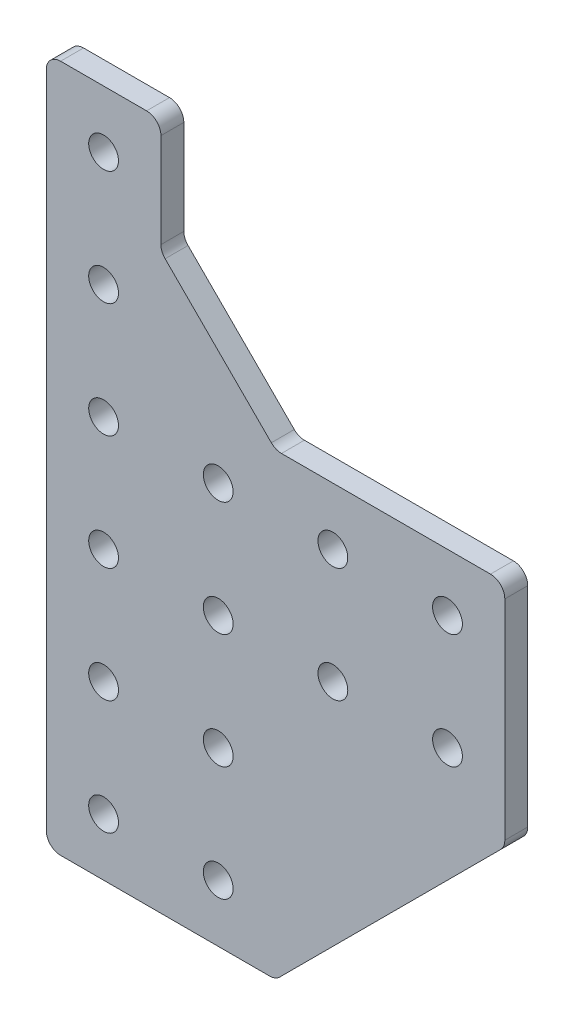
ISO-10303-21;
HEADER;
FILE_DESCRIPTION(('STEP AP214'),'2;1');
FILE_NAME('part.step','',(''),(''),'','','');
FILE_SCHEMA(('AUTOMOTIVE_DESIGN { 1 0 10303 214 1 1 1 1 }'));
ENDSEC;
DATA;
#1=APPLICATION_CONTEXT('core data for automotive mechanical design processes');
#2=APPLICATION_PROTOCOL_DEFINITION('international standard','automotive_design',2000,#1);
#3=PRODUCT_CONTEXT('',#1,'mechanical');
#4=PRODUCT('Part','Part','',(#3));
#5=PRODUCT_RELATED_PRODUCT_CATEGORY('part','',(#4));
#6=PRODUCT_DEFINITION_FORMATION('','',#4);
#7=PRODUCT_DEFINITION_CONTEXT('part definition',#1,'design');
#8=PRODUCT_DEFINITION('design','',#6,#7);
#9=PRODUCT_DEFINITION_SHAPE('','',#8);
#10=(LENGTH_UNIT() NAMED_UNIT(*) SI_UNIT(.MILLI.,.METRE.));
#11=(NAMED_UNIT(*) PLANE_ANGLE_UNIT() SI_UNIT($,.RADIAN.));
#12=(NAMED_UNIT(*) SI_UNIT($,.STERADIAN.) SOLID_ANGLE_UNIT());
#13=UNCERTAINTY_MEASURE_WITH_UNIT(LENGTH_MEASURE(1.E-05),#10,'distance_accuracy_value','');
#14=(GEOMETRIC_REPRESENTATION_CONTEXT(3) GLOBAL_UNCERTAINTY_ASSIGNED_CONTEXT((#13)) GLOBAL_UNIT_ASSIGNED_CONTEXT((#10,
#11,#12)) REPRESENTATION_CONTEXT('',''));
#15=CARTESIAN_POINT('',(0.,0.,0.));
#16=DIRECTION('',(0.,0.,1.));
#17=DIRECTION('',(1.,0.,0.));
#18=AXIS2_PLACEMENT_3D('',#15,#16,#17);
#19=CARTESIAN_POINT('',(2.5,37.5,4.));
#20=DIRECTION('',(0.,0.,-1.));
#21=DIRECTION('',(-1.,0.,0.));
#22=AXIS2_PLACEMENT_3D('',#19,#20,#21);
#23=PLANE('',#22);
#24=DIRECTION('',(0.,-1.,0.));
#25=VECTOR('',#24,1.);
#26=CARTESIAN_POINT('',(0.,0.,4.));
#27=LINE('',#26,#25);
#28=CARTESIAN_POINT('',(0.,37.5,4.));
#29=VERTEX_POINT('',#28);
#30=CARTESIAN_POINT('',(0.,-77.5,4.));
#31=VERTEX_POINT('',#30);
#32=EDGE_CURVE('E119',#29,#31,#27,.T.);
#33=ORIENTED_EDGE('',*,*,#32,.T.);
#34=CARTESIAN_POINT('',(2.5,-77.5,4.));
#35=DIRECTION('',(0.,0.,1.));
#36=DIRECTION('',(1.,0.,0.));
#37=AXIS2_PLACEMENT_3D('',#34,#35,#36);
#38=CIRCLE('',#37,2.5);
#39=CARTESIAN_POINT('',(2.50000000000002,-80.,4.));
#40=VERTEX_POINT('',#39);
#41=EDGE_CURVE('E300',#31,#40,#38,.T.);
#42=ORIENTED_EDGE('',*,*,#41,.T.);
#43=DIRECTION('',(1.,0.,0.));
#44=VECTOR('',#43,1.);
#45=CARTESIAN_POINT('',(2.50000000000002,-80.,4.));
#46=LINE('',#45,#44);
#47=CARTESIAN_POINT('',(38.9644660940673,-80.,4.));
#48=VERTEX_POINT('',#47);
#49=EDGE_CURVE('E251',#40,#48,#46,.T.);
#50=ORIENTED_EDGE('',*,*,#49,.T.);
#51=CARTESIAN_POINT('',(38.9644660940673,-77.5,4.));
#52=DIRECTION('',(0.,0.,1.));
#53=DIRECTION('',(-1.,0.,0.));
#54=AXIS2_PLACEMENT_3D('',#51,#52,#53);
#55=CIRCLE('',#54,2.50000000000001);
#56=CARTESIAN_POINT('',(40.7322330470336,-79.2677669529664,4.));
#57=VERTEX_POINT('',#56);
#58=EDGE_CURVE('E270',#48,#57,#55,.T.);
#59=ORIENTED_EDGE('',*,*,#58,.T.);
#60=DIRECTION('',(0.707106781186547,0.707106781186548,0.));
#61=VECTOR('',#60,1.);
#62=CARTESIAN_POINT('',(40.7322330470336,-79.2677669529664,4.));
#63=LINE('',#62,#61);
#64=CARTESIAN_POINT('',(79.2677669529664,-40.7322330470336,4.));
#65=VERTEX_POINT('',#64);
#66=EDGE_CURVE('E267',#57,#65,#63,.T.);
#67=ORIENTED_EDGE('',*,*,#66,.T.);
#68=CARTESIAN_POINT('',(77.5,-38.9644660940673,4.));
#69=DIRECTION('',(0.,0.,1.));
#70=DIRECTION('',(-1.,0.,0.));
#71=AXIS2_PLACEMENT_3D('',#68,#69,#70);
#72=CIRCLE('',#71,2.5);
#73=CARTESIAN_POINT('',(80.,-38.9644660940673,4.));
#74=VERTEX_POINT('',#73);
#75=EDGE_CURVE('E269',#65,#74,#72,.T.);
#76=ORIENTED_EDGE('',*,*,#75,.T.);
#77=DIRECTION('',(0.,1.,0.));
#78=VECTOR('',#77,1.);
#79=CARTESIAN_POINT('',(80.,-2.5,4.));
#80=LINE('',#79,#78);
#81=CARTESIAN_POINT('',(80.,-2.5,4.));
#82=VERTEX_POINT('',#81);
#83=EDGE_CURVE('E272',#74,#82,#80,.T.);
#84=ORIENTED_EDGE('',*,*,#83,.T.);
#85=CARTESIAN_POINT('',(77.5,-2.5,4.));
#86=DIRECTION('',(0.,0.,1.));
#87=DIRECTION('',(-1.,0.,0.));
#88=AXIS2_PLACEMENT_3D('',#85,#86,#87);
#89=CIRCLE('',#88,2.5);
#90=CARTESIAN_POINT('',(77.5,0.,4.));
#91=VERTEX_POINT('',#90);
#92=EDGE_CURVE('E278',#82,#91,#89,.T.);
#93=ORIENTED_EDGE('',*,*,#92,.T.);
#94=DIRECTION('',(-1.,0.,0.));
#95=VECTOR('',#94,1.);
#96=CARTESIAN_POINT('',(41.0355339059327,0.,4.));
#97=LINE('',#96,#95);
#98=CARTESIAN_POINT('',(41.0355339059327,0.,4.));
#99=VERTEX_POINT('',#98);
#100=EDGE_CURVE('E280',#91,#99,#97,.T.);
#101=ORIENTED_EDGE('',*,*,#100,.T.);
#102=CARTESIAN_POINT('',(41.0355339059327,2.5,4.));
#103=DIRECTION('',(0.,0.,-1.));
#104=DIRECTION('',(1.,0.,0.));
#105=AXIS2_PLACEMENT_3D('',#102,#103,#104);
#106=CIRCLE('',#105,2.5);
#107=CARTESIAN_POINT('',(39.2677669529663,0.732233047033641,4.));
#108=VERTEX_POINT('',#107);
#109=EDGE_CURVE('E282',#99,#108,#106,.T.);
#110=ORIENTED_EDGE('',*,*,#109,.T.);
#111=DIRECTION('',(-0.707106781186546,0.707106781186549,0.));
#112=VECTOR('',#111,1.);
#113=CARTESIAN_POINT('',(20.7322330470336,19.2677669529664,4.));
#114=LINE('',#113,#112);
#115=CARTESIAN_POINT('',(20.7322330470336,19.2677669529664,4.));
#116=VERTEX_POINT('',#115);
#117=EDGE_CURVE('E284',#108,#116,#114,.T.);
#118=ORIENTED_EDGE('',*,*,#117,.T.);
#119=CARTESIAN_POINT('',(22.5,21.0355339059327,4.));
#120=DIRECTION('',(0.,0.,-1.));
#121=DIRECTION('',(1.,0.,0.));
#122=AXIS2_PLACEMENT_3D('',#119,#120,#121);
#123=CIRCLE('',#122,2.5);
#124=CARTESIAN_POINT('',(20.,21.0355339059327,4.));
#125=VERTEX_POINT('',#124);
#126=EDGE_CURVE('E286',#116,#125,#123,.T.);
#127=ORIENTED_EDGE('',*,*,#126,.T.);
#128=DIRECTION('',(0.,1.,0.));
#129=VECTOR('',#128,1.);
#130=CARTESIAN_POINT('',(20.,37.5,4.));
#131=LINE('',#130,#129);
#132=CARTESIAN_POINT('',(20.,37.5,4.));
#133=VERTEX_POINT('',#132);
#134=EDGE_CURVE('E163',#125,#133,#131,.T.);
#135=ORIENTED_EDGE('',*,*,#134,.T.);
#136=CARTESIAN_POINT('',(17.5,37.5,4.));
#137=DIRECTION('',(0.,0.,1.));
#138=DIRECTION('',(-1.,0.,0.));
#139=AXIS2_PLACEMENT_3D('',#136,#137,#138);
#140=CIRCLE('',#139,2.5);
#141=CARTESIAN_POINT('',(17.5,40.,4.));
#142=VERTEX_POINT('',#141);
#143=EDGE_CURVE('E157',#133,#142,#140,.T.);
#144=ORIENTED_EDGE('',*,*,#143,.T.);
#145=DIRECTION('',(-1.,0.,0.));
#146=VECTOR('',#145,1.);
#147=CARTESIAN_POINT('',(2.50000000000002,40.,4.));
#148=LINE('',#147,#146);
#149=CARTESIAN_POINT('',(2.50000000000002,40.,4.));
#150=VERTEX_POINT('',#149);
#151=EDGE_CURVE('E161',#142,#150,#148,.T.);
#152=ORIENTED_EDGE('',*,*,#151,.T.);
#153=CARTESIAN_POINT('',(2.5,37.5,4.));
#154=DIRECTION('',(0.,0.,1.));
#155=DIRECTION('',(-1.,0.,0.));
#156=AXIS2_PLACEMENT_3D('',#153,#154,#155);
#157=CIRCLE('',#156,2.5);
#158=EDGE_CURVE('E53',#150,#29,#157,.T.);
#159=ORIENTED_EDGE('',*,*,#158,.T.);
#160=EDGE_LOOP('',(#33,#42,#50,#59,#67,#76,#84,#93,#101,#110,#118,#127,#135,#144,#152,#159));
#161=FACE_BOUND('',#160,.T.);
#162=CARTESIAN_POINT('',(10.,-10.,4.));
#163=DIRECTION('',(0.,0.,1.));
#164=DIRECTION('',(1.,0.,0.));
#165=AXIS2_PLACEMENT_3D('',#162,#163,#164);
#166=CIRCLE('',#165,2.6);
#167=CARTESIAN_POINT('',(12.6,-10.,4.));
#168=VERTEX_POINT('',#167);
#169=EDGE_CURVE('E183',#168,#168,#166,.T.);
#170=ORIENTED_EDGE('',*,*,#169,.F.);
#171=EDGE_LOOP('',(#170));
#172=FACE_BOUND('',#171,.T.);
#173=CARTESIAN_POINT('',(30.,-10.,4.));
#174=DIRECTION('',(0.,0.,1.));
#175=DIRECTION('',(1.,0.,0.));
#176=AXIS2_PLACEMENT_3D('',#173,#174,#175);
#177=CIRCLE('',#176,2.6);
#178=CARTESIAN_POINT('',(32.6,-10.,4.));
#179=VERTEX_POINT('',#178);
#180=EDGE_CURVE('E683',#179,#179,#177,.T.);
#181=ORIENTED_EDGE('',*,*,#180,.F.);
#182=EDGE_LOOP('',(#181));
#183=FACE_BOUND('',#182,.T.);
#184=CARTESIAN_POINT('',(30.0000000000002,-30.,4.));
#185=DIRECTION('',(0.,0.,1.));
#186=DIRECTION('',(1.,0.,0.));
#187=AXIS2_PLACEMENT_3D('',#184,#185,#186);
#188=CIRCLE('',#187,2.6);
#189=CARTESIAN_POINT('',(32.6000000000002,-30.,4.));
#190=VERTEX_POINT('',#189);
#191=EDGE_CURVE('E677',#190,#190,#188,.T.);
#192=ORIENTED_EDGE('',*,*,#191,.F.);
#193=EDGE_LOOP('',(#192));
#194=FACE_BOUND('',#193,.T.);
#195=CARTESIAN_POINT('',(30.0000000000004,-50.,4.));
#196=DIRECTION('',(0.,0.,1.));
#197=DIRECTION('',(1.,0.,0.));
#198=AXIS2_PLACEMENT_3D('',#195,#196,#197);
#199=CIRCLE('',#198,2.6);
#200=CARTESIAN_POINT('',(32.6000000000004,-50.,4.));
#201=VERTEX_POINT('',#200);
#202=EDGE_CURVE('E671',#201,#201,#199,.T.);
#203=ORIENTED_EDGE('',*,*,#202,.F.);
#204=EDGE_LOOP('',(#203));
#205=FACE_BOUND('',#204,.T.);
#206=CARTESIAN_POINT('',(30.0000000000006,-70.,4.));
#207=DIRECTION('',(0.,0.,1.));
#208=DIRECTION('',(1.,0.,0.));
#209=AXIS2_PLACEMENT_3D('',#206,#207,#208);
#210=CIRCLE('',#209,2.59999999999999);
#211=CARTESIAN_POINT('',(32.6000000000006,-70.,4.));
#212=VERTEX_POINT('',#211);
#213=EDGE_CURVE('E665',#212,#212,#210,.T.);
#214=ORIENTED_EDGE('',*,*,#213,.F.);
#215=EDGE_LOOP('',(#214));
#216=FACE_BOUND('',#215,.T.);
#217=CARTESIAN_POINT('',(10.0000000000002,-30.,4.));
#218=DIRECTION('',(0.,0.,1.));
#219=DIRECTION('',(1.,0.,0.));
#220=AXIS2_PLACEMENT_3D('',#217,#218,#219);
#221=CIRCLE('',#220,2.6);
#222=CARTESIAN_POINT('',(12.6000000000002,-30.,4.));
#223=VERTEX_POINT('',#222);
#224=EDGE_CURVE('E659',#223,#223,#221,.T.);
#225=ORIENTED_EDGE('',*,*,#224,.F.);
#226=EDGE_LOOP('',(#225));
#227=FACE_BOUND('',#226,.T.);
#228=CARTESIAN_POINT('',(10.0000000000004,-50.,4.));
#229=DIRECTION('',(0.,0.,1.));
#230=DIRECTION('',(1.,0.,0.));
#231=AXIS2_PLACEMENT_3D('',#228,#229,#230);
#232=CIRCLE('',#231,2.6);
#233=CARTESIAN_POINT('',(12.6000000000004,-50.,4.));
#234=VERTEX_POINT('',#233);
#235=EDGE_CURVE('E653',#234,#234,#232,.T.);
#236=ORIENTED_EDGE('',*,*,#235,.F.);
#237=EDGE_LOOP('',(#236));
#238=FACE_BOUND('',#237,.T.);
#239=CARTESIAN_POINT('',(10.0000000000006,-70.,4.));
#240=DIRECTION('',(0.,0.,1.));
#241=DIRECTION('',(1.,0.,0.));
#242=AXIS2_PLACEMENT_3D('',#239,#240,#241);
#243=CIRCLE('',#242,2.6);
#244=CARTESIAN_POINT('',(12.6000000000006,-70.,4.));
#245=VERTEX_POINT('',#244);
#246=EDGE_CURVE('E647',#245,#245,#243,.T.);
#247=ORIENTED_EDGE('',*,*,#246,.F.);
#248=EDGE_LOOP('',(#247));
#249=FACE_BOUND('',#248,.T.);
#250=CARTESIAN_POINT('',(50.,-10.,4.));
#251=DIRECTION('',(0.,0.,1.));
#252=DIRECTION('',(1.,0.,0.));
#253=AXIS2_PLACEMENT_3D('',#250,#251,#252);
#254=CIRCLE('',#253,2.6);
#255=CARTESIAN_POINT('',(52.6,-10.,4.));
#256=VERTEX_POINT('',#255);
#257=EDGE_CURVE('E641',#256,#256,#254,.T.);
#258=ORIENTED_EDGE('',*,*,#257,.F.);
#259=EDGE_LOOP('',(#258));
#260=FACE_BOUND('',#259,.T.);
#261=CARTESIAN_POINT('',(50.0000000000002,-30.,4.));
#262=DIRECTION('',(0.,0.,1.));
#263=DIRECTION('',(1.,0.,0.));
#264=AXIS2_PLACEMENT_3D('',#261,#262,#263);
#265=CIRCLE('',#264,2.6);
#266=CARTESIAN_POINT('',(52.6000000000002,-30.,4.));
#267=VERTEX_POINT('',#266);
#268=EDGE_CURVE('E635',#267,#267,#265,.T.);
#269=ORIENTED_EDGE('',*,*,#268,.F.);
#270=EDGE_LOOP('',(#269));
#271=FACE_BOUND('',#270,.T.);
#272=CARTESIAN_POINT('',(70.,-10.,4.));
#273=DIRECTION('',(0.,0.,1.));
#274=DIRECTION('',(1.,0.,0.));
#275=AXIS2_PLACEMENT_3D('',#272,#273,#274);
#276=CIRCLE('',#275,2.59999999999999);
#277=CARTESIAN_POINT('',(72.6,-10.,4.));
#278=VERTEX_POINT('',#277);
#279=EDGE_CURVE('E629',#278,#278,#276,.T.);
#280=ORIENTED_EDGE('',*,*,#279,.F.);
#281=EDGE_LOOP('',(#280));
#282=FACE_BOUND('',#281,.T.);
#283=CARTESIAN_POINT('',(70.0000000000002,-30.,4.));
#284=DIRECTION('',(0.,0.,1.));
#285=DIRECTION('',(1.,0.,0.));
#286=AXIS2_PLACEMENT_3D('',#283,#284,#285);
#287=CIRCLE('',#286,2.60000000000002);
#288=CARTESIAN_POINT('',(72.6000000000002,-30.,4.));
#289=VERTEX_POINT('',#288);
#290=EDGE_CURVE('E623',#289,#289,#287,.T.);
#291=ORIENTED_EDGE('',*,*,#290,.F.);
#292=EDGE_LOOP('',(#291));
#293=FACE_BOUND('',#292,.T.);
#294=CARTESIAN_POINT('',(9.99999999999993,10.,4.));
#295=DIRECTION('',(0.,0.,1.));
#296=DIRECTION('',(1.,0.,0.));
#297=AXIS2_PLACEMENT_3D('',#294,#295,#296);
#298=CIRCLE('',#297,2.6);
#299=CARTESIAN_POINT('',(12.5999999999999,10.,4.));
#300=VERTEX_POINT('',#299);
#301=EDGE_CURVE('E617',#300,#300,#298,.T.);
#302=ORIENTED_EDGE('',*,*,#301,.F.);
#303=EDGE_LOOP('',(#302));
#304=FACE_BOUND('',#303,.T.);
#305=CARTESIAN_POINT('',(9.99999999999986,30.,4.));
#306=DIRECTION('',(0.,0.,1.));
#307=DIRECTION('',(1.,0.,0.));
#308=AXIS2_PLACEMENT_3D('',#305,#306,#307);
#309=CIRCLE('',#308,2.6);
#310=CARTESIAN_POINT('',(12.5999999999999,30.,4.));
#311=VERTEX_POINT('',#310);
#312=EDGE_CURVE('E608',#311,#311,#309,.T.);
#313=ORIENTED_EDGE('',*,*,#312,.F.);
#314=EDGE_LOOP('',(#313));
#315=FACE_BOUND('',#314,.T.);
#316=ADVANCED_FACE('F36',(#161,#172,#183,#194,#205,#216,#227,#238,#249,#260,#271,#282,#293,#304,
#315),#23,.F.);
#317=CARTESIAN_POINT('',(2.5,37.5,0.));
#318=DIRECTION('',(0.,0.,-1.));
#319=DIRECTION('',(-1.,0.,0.));
#320=AXIS2_PLACEMENT_3D('',#317,#318,#319);
#321=PLANE('',#320);
#322=CARTESIAN_POINT('',(9.99999999999993,10.,0.));
#323=DIRECTION('',(0.,0.,1.));
#324=DIRECTION('',(1.,0.,0.));
#325=AXIS2_PLACEMENT_3D('',#322,#323,#324);
#326=CIRCLE('',#325,2.6);
#327=CARTESIAN_POINT('',(12.5999999999999,10.,0.));
#328=VERTEX_POINT('',#327);
#329=EDGE_CURVE('E614',#328,#328,#326,.T.);
#330=ORIENTED_EDGE('',*,*,#329,.T.);
#331=EDGE_LOOP('',(#330));
#332=FACE_BOUND('',#331,.T.);
#333=CARTESIAN_POINT('',(70.,-10.,0.));
#334=DIRECTION('',(0.,0.,1.));
#335=DIRECTION('',(1.,0.,0.));
#336=AXIS2_PLACEMENT_3D('',#333,#334,#335);
#337=CIRCLE('',#336,2.59999999999999);
#338=CARTESIAN_POINT('',(72.6,-10.,0.));
#339=VERTEX_POINT('',#338);
#340=EDGE_CURVE('E626',#339,#339,#337,.T.);
#341=ORIENTED_EDGE('',*,*,#340,.T.);
#342=EDGE_LOOP('',(#341));
#343=FACE_BOUND('',#342,.T.);
#344=CARTESIAN_POINT('',(50.,-10.,0.));
#345=DIRECTION('',(0.,0.,1.));
#346=DIRECTION('',(1.,0.,0.));
#347=AXIS2_PLACEMENT_3D('',#344,#345,#346);
#348=CIRCLE('',#347,2.6);
#349=CARTESIAN_POINT('',(52.6,-10.,0.));
#350=VERTEX_POINT('',#349);
#351=EDGE_CURVE('E638',#350,#350,#348,.T.);
#352=ORIENTED_EDGE('',*,*,#351,.T.);
#353=EDGE_LOOP('',(#352));
#354=FACE_BOUND('',#353,.T.);
#355=CARTESIAN_POINT('',(10.0000000000004,-50.,0.));
#356=DIRECTION('',(0.,0.,1.));
#357=DIRECTION('',(1.,0.,0.));
#358=AXIS2_PLACEMENT_3D('',#355,#356,#357);
#359=CIRCLE('',#358,2.6);
#360=CARTESIAN_POINT('',(12.6000000000004,-50.,0.));
#361=VERTEX_POINT('',#360);
#362=EDGE_CURVE('E650',#361,#361,#359,.T.);
#363=ORIENTED_EDGE('',*,*,#362,.T.);
#364=EDGE_LOOP('',(#363));
#365=FACE_BOUND('',#364,.T.);
#366=CARTESIAN_POINT('',(30.0000000000006,-70.,0.));
#367=DIRECTION('',(0.,0.,1.));
#368=DIRECTION('',(1.,0.,0.));
#369=AXIS2_PLACEMENT_3D('',#366,#367,#368);
#370=CIRCLE('',#369,2.59999999999999);
#371=CARTESIAN_POINT('',(32.6000000000006,-70.,0.));
#372=VERTEX_POINT('',#371);
#373=EDGE_CURVE('E662',#372,#372,#370,.T.);
#374=ORIENTED_EDGE('',*,*,#373,.T.);
#375=EDGE_LOOP('',(#374));
#376=FACE_BOUND('',#375,.T.);
#377=CARTESIAN_POINT('',(30.0000000000002,-30.,0.));
#378=DIRECTION('',(0.,0.,1.));
#379=DIRECTION('',(1.,0.,0.));
#380=AXIS2_PLACEMENT_3D('',#377,#378,#379);
#381=CIRCLE('',#380,2.6);
#382=CARTESIAN_POINT('',(32.6000000000002,-30.,0.));
#383=VERTEX_POINT('',#382);
#384=EDGE_CURVE('E674',#383,#383,#381,.T.);
#385=ORIENTED_EDGE('',*,*,#384,.T.);
#386=EDGE_LOOP('',(#385));
#387=FACE_BOUND('',#386,.T.);
#388=CARTESIAN_POINT('',(10.,-10.,0.));
#389=DIRECTION('',(0.,0.,1.));
#390=DIRECTION('',(1.,0.,0.));
#391=AXIS2_PLACEMENT_3D('',#388,#389,#390);
#392=CIRCLE('',#391,2.6);
#393=CARTESIAN_POINT('',(12.6,-10.,0.));
#394=VERTEX_POINT('',#393);
#395=EDGE_CURVE('E304',#394,#394,#392,.T.);
#396=ORIENTED_EDGE('',*,*,#395,.T.);
#397=EDGE_LOOP('',(#396));
#398=FACE_BOUND('',#397,.T.);
#399=DIRECTION('',(0.,-1.,0.));
#400=VECTOR('',#399,1.);
#401=CARTESIAN_POINT('',(0.,0.,0.));
#402=LINE('',#401,#400);
#403=CARTESIAN_POINT('',(0.,37.5,0.));
#404=VERTEX_POINT('',#403);
#405=CARTESIAN_POINT('',(0.,-77.5,0.));
#406=VERTEX_POINT('',#405);
#407=EDGE_CURVE('E113',#404,#406,#402,.T.);
#408=ORIENTED_EDGE('',*,*,#407,.F.);
#409=CARTESIAN_POINT('',(2.5,37.5,0.));
#410=DIRECTION('',(0.,0.,1.));
#411=DIRECTION('',(-1.,0.,0.));
#412=AXIS2_PLACEMENT_3D('',#409,#410,#411);
#413=CIRCLE('',#412,2.5);
#414=CARTESIAN_POINT('',(2.50000000000002,40.,0.));
#415=VERTEX_POINT('',#414);
#416=EDGE_CURVE('E209',#415,#404,#413,.T.);
#417=ORIENTED_EDGE('',*,*,#416,.F.);
#418=DIRECTION('',(-1.,0.,0.));
#419=VECTOR('',#418,1.);
#420=CARTESIAN_POINT('',(2.50000000000002,40.,0.));
#421=LINE('',#420,#419);
#422=CARTESIAN_POINT('',(17.5,40.,0.));
#423=VERTEX_POINT('',#422);
#424=EDGE_CURVE('E106',#423,#415,#421,.T.);
#425=ORIENTED_EDGE('',*,*,#424,.F.);
#426=CARTESIAN_POINT('',(17.5,37.5,0.));
#427=DIRECTION('',(0.,0.,1.));
#428=DIRECTION('',(-1.,0.,0.));
#429=AXIS2_PLACEMENT_3D('',#426,#427,#428);
#430=CIRCLE('',#429,2.5);
#431=CARTESIAN_POINT('',(20.,37.5,0.));
#432=VERTEX_POINT('',#431);
#433=EDGE_CURVE('E171',#432,#423,#430,.T.);
#434=ORIENTED_EDGE('',*,*,#433,.F.);
#435=DIRECTION('',(0.,1.,0.));
#436=VECTOR('',#435,1.);
#437=CARTESIAN_POINT('',(20.,37.5,0.));
#438=LINE('',#437,#436);
#439=CARTESIAN_POINT('',(20.,21.0355339059327,0.));
#440=VERTEX_POINT('',#439);
#441=EDGE_CURVE('E205',#440,#432,#438,.T.);
#442=ORIENTED_EDGE('',*,*,#441,.F.);
#443=CARTESIAN_POINT('',(22.5,21.0355339059327,0.));
#444=DIRECTION('',(0.,0.,-1.));
#445=DIRECTION('',(1.,0.,0.));
#446=AXIS2_PLACEMENT_3D('',#443,#444,#445);
#447=CIRCLE('',#446,2.5);
#448=CARTESIAN_POINT('',(20.7322330470336,19.2677669529664,0.));
#449=VERTEX_POINT('',#448);
#450=EDGE_CURVE('E203',#449,#440,#447,.T.);
#451=ORIENTED_EDGE('',*,*,#450,.F.);
#452=DIRECTION('',(-0.707106781186546,0.707106781186549,0.));
#453=VECTOR('',#452,1.);
#454=CARTESIAN_POINT('',(20.7322330470336,19.2677669529664,0.));
#455=LINE('',#454,#453);
#456=CARTESIAN_POINT('',(39.2677669529663,0.732233047033641,0.));
#457=VERTEX_POINT('',#456);
#458=EDGE_CURVE('E201',#457,#449,#455,.T.);
#459=ORIENTED_EDGE('',*,*,#458,.F.);
#460=CARTESIAN_POINT('',(41.0355339059327,2.5,0.));
#461=DIRECTION('',(0.,0.,-1.));
#462=DIRECTION('',(1.,0.,0.));
#463=AXIS2_PLACEMENT_3D('',#460,#461,#462);
#464=CIRCLE('',#463,2.5);
#465=CARTESIAN_POINT('',(41.0355339059327,0.,0.));
#466=VERTEX_POINT('',#465);
#467=EDGE_CURVE('E199',#466,#457,#464,.T.);
#468=ORIENTED_EDGE('',*,*,#467,.F.);
#469=DIRECTION('',(-1.,0.,0.));
#470=VECTOR('',#469,1.);
#471=CARTESIAN_POINT('',(41.0355339059327,0.,0.));
#472=LINE('',#471,#470);
#473=CARTESIAN_POINT('',(77.5,0.,0.));
#474=VERTEX_POINT('',#473);
#475=EDGE_CURVE('E197',#474,#466,#472,.T.);
#476=ORIENTED_EDGE('',*,*,#475,.F.);
#477=CARTESIAN_POINT('',(77.5,-2.5,0.));
#478=DIRECTION('',(0.,0.,1.));
#479=DIRECTION('',(-1.,0.,0.));
#480=AXIS2_PLACEMENT_3D('',#477,#478,#479);
#481=CIRCLE('',#480,2.5);
#482=CARTESIAN_POINT('',(80.,-2.5,0.));
#483=VERTEX_POINT('',#482);
#484=EDGE_CURVE('E195',#483,#474,#481,.T.);
#485=ORIENTED_EDGE('',*,*,#484,.F.);
#486=DIRECTION('',(0.,1.,0.));
#487=VECTOR('',#486,1.);
#488=CARTESIAN_POINT('',(80.,-2.5,0.));
#489=LINE('',#488,#487);
#490=CARTESIAN_POINT('',(80.,-38.9644660940673,0.));
#491=VERTEX_POINT('',#490);
#492=EDGE_CURVE('E193',#491,#483,#489,.T.);
#493=ORIENTED_EDGE('',*,*,#492,.F.);
#494=CARTESIAN_POINT('',(77.5,-38.9644660940673,0.));
#495=DIRECTION('',(0.,0.,1.));
#496=DIRECTION('',(-1.,0.,0.));
#497=AXIS2_PLACEMENT_3D('',#494,#495,#496);
#498=CIRCLE('',#497,2.5);
#499=CARTESIAN_POINT('',(79.2677669529664,-40.7322330470336,0.));
#500=VERTEX_POINT('',#499);
#501=EDGE_CURVE('E191',#500,#491,#498,.T.);
#502=ORIENTED_EDGE('',*,*,#501,.F.);
#503=DIRECTION('',(0.707106781186547,0.707106781186548,0.));
#504=VECTOR('',#503,1.);
#505=CARTESIAN_POINT('',(40.7322330470336,-79.2677669529664,0.));
#506=LINE('',#505,#504);
#507=CARTESIAN_POINT('',(40.7322330470336,-79.2677669529664,0.));
#508=VERTEX_POINT('',#507);
#509=EDGE_CURVE('E189',#508,#500,#506,.T.);
#510=ORIENTED_EDGE('',*,*,#509,.F.);
#511=CARTESIAN_POINT('',(38.9644660940673,-77.5,0.));
#512=DIRECTION('',(0.,0.,1.));
#513=DIRECTION('',(-1.,0.,0.));
#514=AXIS2_PLACEMENT_3D('',#511,#512,#513);
#515=CIRCLE('',#514,2.50000000000001);
#516=CARTESIAN_POINT('',(38.9644660940673,-80.,0.));
#517=VERTEX_POINT('',#516);
#518=EDGE_CURVE('E187',#517,#508,#515,.T.);
#519=ORIENTED_EDGE('',*,*,#518,.F.);
#520=DIRECTION('',(1.,0.,0.));
#521=VECTOR('',#520,1.);
#522=CARTESIAN_POINT('',(2.50000000000002,-80.,0.));
#523=LINE('',#522,#521);
#524=CARTESIAN_POINT('',(2.50000000000002,-80.,0.));
#525=VERTEX_POINT('',#524);
#526=EDGE_CURVE('E185',#525,#517,#523,.T.);
#527=ORIENTED_EDGE('',*,*,#526,.F.);
#528=CARTESIAN_POINT('',(2.5,-77.5,0.));
#529=DIRECTION('',(0.,0.,1.));
#530=DIRECTION('',(1.,0.,0.));
#531=AXIS2_PLACEMENT_3D('',#528,#529,#530);
#532=CIRCLE('',#531,2.5);
#533=EDGE_CURVE('E182',#406,#525,#532,.T.);
#534=ORIENTED_EDGE('',*,*,#533,.F.);
#535=EDGE_LOOP('',(#408,#417,#425,#434,#442,#451,#459,#468,#476,#485,#493,#502,#510,#519,#527,#534));
#536=FACE_BOUND('',#535,.T.);
#537=CARTESIAN_POINT('',(30.,-10.,0.));
#538=DIRECTION('',(0.,0.,1.));
#539=DIRECTION('',(1.,0.,0.));
#540=AXIS2_PLACEMENT_3D('',#537,#538,#539);
#541=CIRCLE('',#540,2.6);
#542=CARTESIAN_POINT('',(32.6,-10.,0.));
#543=VERTEX_POINT('',#542);
#544=EDGE_CURVE('E680',#543,#543,#541,.T.);
#545=ORIENTED_EDGE('',*,*,#544,.T.);
#546=EDGE_LOOP('',(#545));
#547=FACE_BOUND('',#546,.T.);
#548=CARTESIAN_POINT('',(30.0000000000004,-50.,0.));
#549=DIRECTION('',(0.,0.,1.));
#550=DIRECTION('',(1.,0.,0.));
#551=AXIS2_PLACEMENT_3D('',#548,#549,#550);
#552=CIRCLE('',#551,2.6);
#553=CARTESIAN_POINT('',(32.6000000000004,-50.,0.));
#554=VERTEX_POINT('',#553);
#555=EDGE_CURVE('E668',#554,#554,#552,.T.);
#556=ORIENTED_EDGE('',*,*,#555,.T.);
#557=EDGE_LOOP('',(#556));
#558=FACE_BOUND('',#557,.T.);
#559=CARTESIAN_POINT('',(10.0000000000002,-30.,0.));
#560=DIRECTION('',(0.,0.,1.));
#561=DIRECTION('',(1.,0.,0.));
#562=AXIS2_PLACEMENT_3D('',#559,#560,#561);
#563=CIRCLE('',#562,2.6);
#564=CARTESIAN_POINT('',(12.6000000000002,-30.,0.));
#565=VERTEX_POINT('',#564);
#566=EDGE_CURVE('E656',#565,#565,#563,.T.);
#567=ORIENTED_EDGE('',*,*,#566,.T.);
#568=EDGE_LOOP('',(#567));
#569=FACE_BOUND('',#568,.T.);
#570=CARTESIAN_POINT('',(10.0000000000006,-70.,0.));
#571=DIRECTION('',(0.,0.,1.));
#572=DIRECTION('',(1.,0.,0.));
#573=AXIS2_PLACEMENT_3D('',#570,#571,#572);
#574=CIRCLE('',#573,2.6);
#575=CARTESIAN_POINT('',(12.6000000000006,-70.,0.));
#576=VERTEX_POINT('',#575);
#577=EDGE_CURVE('E644',#576,#576,#574,.T.);
#578=ORIENTED_EDGE('',*,*,#577,.T.);
#579=EDGE_LOOP('',(#578));
#580=FACE_BOUND('',#579,.T.);
#581=CARTESIAN_POINT('',(50.0000000000002,-30.,0.));
#582=DIRECTION('',(0.,0.,1.));
#583=DIRECTION('',(1.,0.,0.));
#584=AXIS2_PLACEMENT_3D('',#581,#582,#583);
#585=CIRCLE('',#584,2.6);
#586=CARTESIAN_POINT('',(52.6000000000002,-30.,0.));
#587=VERTEX_POINT('',#586);
#588=EDGE_CURVE('E632',#587,#587,#585,.T.);
#589=ORIENTED_EDGE('',*,*,#588,.T.);
#590=EDGE_LOOP('',(#589));
#591=FACE_BOUND('',#590,.T.);
#592=CARTESIAN_POINT('',(70.0000000000002,-30.,0.));
#593=DIRECTION('',(0.,0.,1.));
#594=DIRECTION('',(1.,0.,0.));
#595=AXIS2_PLACEMENT_3D('',#592,#593,#594);
#596=CIRCLE('',#595,2.60000000000002);
#597=CARTESIAN_POINT('',(72.6000000000002,-30.,0.));
#598=VERTEX_POINT('',#597);
#599=EDGE_CURVE('E620',#598,#598,#596,.T.);
#600=ORIENTED_EDGE('',*,*,#599,.T.);
#601=EDGE_LOOP('',(#600));
#602=FACE_BOUND('',#601,.T.);
#603=CARTESIAN_POINT('',(9.99999999999986,30.,0.));
#604=DIRECTION('',(0.,0.,1.));
#605=DIRECTION('',(1.,0.,0.));
#606=AXIS2_PLACEMENT_3D('',#603,#604,#605);
#607=CIRCLE('',#606,2.6);
#608=CARTESIAN_POINT('',(12.5999999999999,30.,0.));
#609=VERTEX_POINT('',#608);
#610=EDGE_CURVE('E611',#609,#609,#607,.T.);
#611=ORIENTED_EDGE('',*,*,#610,.T.);
#612=EDGE_LOOP('',(#611));
#613=FACE_BOUND('',#612,.T.);
#614=ADVANCED_FACE('F255',(#332,#343,#354,#365,#376,#387,#398,#536,#547,#558,#569,#580,#591,
#602,#613),#321,.T.);
#615=CARTESIAN_POINT('',(0.,0.,4.));
#616=DIRECTION('',(1.,0.,0.));
#617=DIRECTION('',(0.,1.,0.));
#618=AXIS2_PLACEMENT_3D('',#615,#616,#617);
#619=PLANE('',#618);
#620=ORIENTED_EDGE('',*,*,#407,.T.);
#621=DIRECTION('',(0.,0.,-1.));
#622=VECTOR('',#621,1.);
#623=CARTESIAN_POINT('',(0.,-77.5,4.));
#624=LINE('',#623,#622);
#625=EDGE_CURVE('E11',#31,#406,#624,.T.);
#626=ORIENTED_EDGE('',*,*,#625,.F.);
#627=ORIENTED_EDGE('',*,*,#32,.F.);
#628=DIRECTION('',(0.,0.,-1.));
#629=VECTOR('',#628,1.);
#630=CARTESIAN_POINT('',(0.,37.5,4.));
#631=LINE('',#630,#629);
#632=EDGE_CURVE('E177',#29,#404,#631,.T.);
#633=ORIENTED_EDGE('',*,*,#632,.T.);
#634=EDGE_LOOP('',(#620,#626,#627,#633));
#635=FACE_BOUND('',#634,.T.);
#636=ADVANCED_FACE('F38',(#635),#619,.F.);
#637=CARTESIAN_POINT('',(2.5,-77.5,4.));
#638=DIRECTION('',(0.,0.,-1.));
#639=DIRECTION('',(-1.,0.,0.));
#640=AXIS2_PLACEMENT_3D('',#637,#638,#639);
#641=CYLINDRICAL_SURFACE('',#640,2.5);
#642=ORIENTED_EDGE('',*,*,#533,.T.);
#643=DIRECTION('',(0.,0.,-1.));
#644=VECTOR('',#643,1.);
#645=CARTESIAN_POINT('',(2.50000000000002,-80.,4.));
#646=LINE('',#645,#644);
#647=EDGE_CURVE('E45',#40,#525,#646,.T.);
#648=ORIENTED_EDGE('',*,*,#647,.F.);
#649=ORIENTED_EDGE('',*,*,#41,.F.);
#650=ORIENTED_EDGE('',*,*,#625,.T.);
#651=EDGE_LOOP('',(#642,#648,#649,#650));
#652=FACE_BOUND('',#651,.T.);
#653=ADVANCED_FACE('F306',(#652),#641,.T.);
#654=CARTESIAN_POINT('',(2.50000000000002,-80.,4.));
#655=DIRECTION('',(0.,1.,0.));
#656=DIRECTION('',(0.,0.,1.));
#657=AXIS2_PLACEMENT_3D('',#654,#655,#656);
#658=PLANE('',#657);
#659=ORIENTED_EDGE('',*,*,#526,.T.);
#660=DIRECTION('',(0.,0.,-1.));
#661=VECTOR('',#660,1.);
#662=CARTESIAN_POINT('',(38.9644660940673,-80.,4.));
#663=LINE('',#662,#661);
#664=EDGE_CURVE('E242',#48,#517,#663,.T.);
#665=ORIENTED_EDGE('',*,*,#664,.F.);
#666=ORIENTED_EDGE('',*,*,#49,.F.);
#667=ORIENTED_EDGE('',*,*,#647,.T.);
#668=EDGE_LOOP('',(#659,#665,#666,#667));
#669=FACE_BOUND('',#668,.T.);
#670=ADVANCED_FACE('F249',(#669),#658,.F.);
#671=CARTESIAN_POINT('',(38.9644660940673,-77.5,4.));
#672=DIRECTION('',(0.,0.,-1.));
#673=DIRECTION('',(-1.,0.,0.));
#674=AXIS2_PLACEMENT_3D('',#671,#672,#673);
#675=CYLINDRICAL_SURFACE('',#674,2.50000000000001);
#676=ORIENTED_EDGE('',*,*,#518,.T.);
#677=DIRECTION('',(0.,0.,-1.));
#678=VECTOR('',#677,1.);
#679=CARTESIAN_POINT('',(40.7322330470336,-79.2677669529664,4.));
#680=LINE('',#679,#678);
#681=EDGE_CURVE('E239',#57,#508,#680,.T.);
#682=ORIENTED_EDGE('',*,*,#681,.F.);
#683=ORIENTED_EDGE('',*,*,#58,.F.);
#684=ORIENTED_EDGE('',*,*,#664,.T.);
#685=EDGE_LOOP('',(#676,#682,#683,#684));
#686=FACE_BOUND('',#685,.T.);
#687=ADVANCED_FACE('F261',(#686),#675,.T.);
#688=CARTESIAN_POINT('',(40.7322330470336,-79.2677669529664,4.));
#689=DIRECTION('',(-0.707106781186548,0.707106781186547,0.));
#690=DIRECTION('',(-0.707106781186547,-0.707106781186548,0.));
#691=AXIS2_PLACEMENT_3D('',#688,#689,#690);
#692=PLANE('',#691);
#693=ORIENTED_EDGE('',*,*,#509,.T.);
#694=DIRECTION('',(0.,0.,-1.));
#695=VECTOR('',#694,1.);
#696=CARTESIAN_POINT('',(79.2677669529664,-40.7322330470336,4.));
#697=LINE('',#696,#695);
#698=EDGE_CURVE('E236',#65,#500,#697,.T.);
#699=ORIENTED_EDGE('',*,*,#698,.F.);
#700=ORIENTED_EDGE('',*,*,#66,.F.);
#701=ORIENTED_EDGE('',*,*,#681,.T.);
#702=EDGE_LOOP('',(#693,#699,#700,#701));
#703=FACE_BOUND('',#702,.T.);
#704=ADVANCED_FACE('F265',(#703),#692,.F.);
#705=CARTESIAN_POINT('',(77.5,-38.9644660940673,4.));
#706=DIRECTION('',(0.,0.,-1.));
#707=DIRECTION('',(-1.,0.,0.));
#708=AXIS2_PLACEMENT_3D('',#705,#706,#707);
#709=CYLINDRICAL_SURFACE('',#708,2.5);
#710=ORIENTED_EDGE('',*,*,#501,.T.);
#711=DIRECTION('',(0.,0.,-1.));
#712=VECTOR('',#711,1.);
#713=CARTESIAN_POINT('',(80.,-38.9644660940673,4.));
#714=LINE('',#713,#712);
#715=EDGE_CURVE('E233',#74,#491,#714,.T.);
#716=ORIENTED_EDGE('',*,*,#715,.F.);
#717=ORIENTED_EDGE('',*,*,#75,.F.);
#718=ORIENTED_EDGE('',*,*,#698,.T.);
#719=EDGE_LOOP('',(#710,#716,#717,#718));
#720=FACE_BOUND('',#719,.T.);
#721=ADVANCED_FACE('F353',(#720),#709,.T.);
#722=CARTESIAN_POINT('',(80.,-2.5,4.));
#723=DIRECTION('',(-1.,0.,0.));
#724=DIRECTION('',(0.,0.,1.));
#725=AXIS2_PLACEMENT_3D('',#722,#723,#724);
#726=PLANE('',#725);
#727=ORIENTED_EDGE('',*,*,#492,.T.);
#728=DIRECTION('',(0.,0.,-1.));
#729=VECTOR('',#728,1.);
#730=CARTESIAN_POINT('',(80.,-2.5,4.));
#731=LINE('',#730,#729);
#732=EDGE_CURVE('E230',#82,#483,#731,.T.);
#733=ORIENTED_EDGE('',*,*,#732,.F.);
#734=ORIENTED_EDGE('',*,*,#83,.F.);
#735=ORIENTED_EDGE('',*,*,#715,.T.);
#736=EDGE_LOOP('',(#727,#733,#734,#735));
#737=FACE_BOUND('',#736,.T.);
#738=ADVANCED_FACE('F349',(#737),#726,.F.);
#739=CARTESIAN_POINT('',(77.5,-2.5,4.));
#740=DIRECTION('',(0.,0.,-1.));
#741=DIRECTION('',(-1.,0.,0.));
#742=AXIS2_PLACEMENT_3D('',#739,#740,#741);
#743=CYLINDRICAL_SURFACE('',#742,2.5);
#744=ORIENTED_EDGE('',*,*,#484,.T.);
#745=DIRECTION('',(0.,0.,-1.));
#746=VECTOR('',#745,1.);
#747=CARTESIAN_POINT('',(77.5,0.,4.));
#748=LINE('',#747,#746);
#749=EDGE_CURVE('E227',#91,#474,#748,.T.);
#750=ORIENTED_EDGE('',*,*,#749,.F.);
#751=ORIENTED_EDGE('',*,*,#92,.F.);
#752=ORIENTED_EDGE('',*,*,#732,.T.);
#753=EDGE_LOOP('',(#744,#750,#751,#752));
#754=FACE_BOUND('',#753,.T.);
#755=ADVANCED_FACE('F345',(#754),#743,.T.);
#756=CARTESIAN_POINT('',(41.0355339059327,0.,4.));
#757=DIRECTION('',(0.,-1.,0.));
#758=DIRECTION('',(0.,0.,-1.));
#759=AXIS2_PLACEMENT_3D('',#756,#757,#758);
#760=PLANE('',#759);
#761=ORIENTED_EDGE('',*,*,#475,.T.);
#762=DIRECTION('',(0.,0.,-1.));
#763=VECTOR('',#762,1.);
#764=CARTESIAN_POINT('',(41.0355339059327,0.,4.));
#765=LINE('',#764,#763);
#766=EDGE_CURVE('E224',#99,#466,#765,.T.);
#767=ORIENTED_EDGE('',*,*,#766,.F.);
#768=ORIENTED_EDGE('',*,*,#100,.F.);
#769=ORIENTED_EDGE('',*,*,#749,.T.);
#770=EDGE_LOOP('',(#761,#767,#768,#769));
#771=FACE_BOUND('',#770,.T.);
#772=ADVANCED_FACE('F341',(#771),#760,.F.);
#773=CARTESIAN_POINT('',(41.0355339059327,2.5,4.));
#774=DIRECTION('',(0.,0.,-1.));
#775=DIRECTION('',(-1.,0.,0.));
#776=AXIS2_PLACEMENT_3D('',#773,#774,#775);
#777=CYLINDRICAL_SURFACE('',#776,2.5);
#778=ORIENTED_EDGE('',*,*,#467,.T.);
#779=DIRECTION('',(0.,0.,-1.));
#780=VECTOR('',#779,1.);
#781=CARTESIAN_POINT('',(39.2677669529663,0.732233047033641,4.));
#782=LINE('',#781,#780);
#783=EDGE_CURVE('E221',#108,#457,#782,.T.);
#784=ORIENTED_EDGE('',*,*,#783,.F.);
#785=ORIENTED_EDGE('',*,*,#109,.F.);
#786=ORIENTED_EDGE('',*,*,#766,.T.);
#787=EDGE_LOOP('',(#778,#784,#785,#786));
#788=FACE_BOUND('',#787,.T.);
#789=ADVANCED_FACE('F337',(#788),#777,.F.);
#790=CARTESIAN_POINT('',(20.7322330470336,19.2677669529664,4.));
#791=DIRECTION('',(-0.707106781186549,-0.707106781186546,0.));
#792=DIRECTION('',(0.707106781186546,-0.707106781186549,0.));
#793=AXIS2_PLACEMENT_3D('',#790,#791,#792);
#794=PLANE('',#793);
#795=ORIENTED_EDGE('',*,*,#458,.T.);
#796=DIRECTION('',(0.,0.,-1.));
#797=VECTOR('',#796,1.);
#798=CARTESIAN_POINT('',(20.7322330470336,19.2677669529664,4.));
#799=LINE('',#798,#797);
#800=EDGE_CURVE('E218',#116,#449,#799,.T.);
#801=ORIENTED_EDGE('',*,*,#800,.F.);
#802=ORIENTED_EDGE('',*,*,#117,.F.);
#803=ORIENTED_EDGE('',*,*,#783,.T.);
#804=EDGE_LOOP('',(#795,#801,#802,#803));
#805=FACE_BOUND('',#804,.T.);
#806=ADVANCED_FACE('F334',(#805),#794,.F.);
#807=CARTESIAN_POINT('',(22.5,21.0355339059327,4.));
#808=DIRECTION('',(0.,0.,-1.));
#809=DIRECTION('',(-1.,0.,0.));
#810=AXIS2_PLACEMENT_3D('',#807,#808,#809);
#811=CYLINDRICAL_SURFACE('',#810,2.5);
#812=ORIENTED_EDGE('',*,*,#450,.T.);
#813=DIRECTION('',(0.,0.,-1.));
#814=VECTOR('',#813,1.);
#815=CARTESIAN_POINT('',(20.,21.0355339059327,4.));
#816=LINE('',#815,#814);
#817=EDGE_CURVE('E215',#125,#440,#816,.T.);
#818=ORIENTED_EDGE('',*,*,#817,.F.);
#819=ORIENTED_EDGE('',*,*,#126,.F.);
#820=ORIENTED_EDGE('',*,*,#800,.T.);
#821=EDGE_LOOP('',(#812,#818,#819,#820));
#822=FACE_BOUND('',#821,.T.);
#823=ADVANCED_FACE('F292',(#822),#811,.F.);
#824=CARTESIAN_POINT('',(20.,37.5,4.));
#825=DIRECTION('',(-1.,0.,0.));
#826=DIRECTION('',(0.,0.,1.));
#827=AXIS2_PLACEMENT_3D('',#824,#825,#826);
#828=PLANE('',#827);
#829=ORIENTED_EDGE('',*,*,#441,.T.);
#830=DIRECTION('',(0.,0.,-1.));
#831=VECTOR('',#830,1.);
#832=CARTESIAN_POINT('',(20.,37.5,4.));
#833=LINE('',#832,#831);
#834=EDGE_CURVE('E172',#133,#432,#833,.T.);
#835=ORIENTED_EDGE('',*,*,#834,.F.);
#836=ORIENTED_EDGE('',*,*,#134,.F.);
#837=ORIENTED_EDGE('',*,*,#817,.T.);
#838=EDGE_LOOP('',(#829,#835,#836,#837));
#839=FACE_BOUND('',#838,.T.);
#840=ADVANCED_FACE('F296',(#839),#828,.F.);
#841=CARTESIAN_POINT('',(17.5,37.5,4.));
#842=DIRECTION('',(0.,0.,-1.));
#843=DIRECTION('',(-1.,0.,0.));
#844=AXIS2_PLACEMENT_3D('',#841,#842,#843);
#845=CYLINDRICAL_SURFACE('',#844,2.5);
#846=ORIENTED_EDGE('',*,*,#433,.T.);
#847=DIRECTION('',(0.,0.,-1.));
#848=VECTOR('',#847,1.);
#849=CARTESIAN_POINT('',(17.5,40.,4.));
#850=LINE('',#849,#848);
#851=EDGE_CURVE('E168',#142,#423,#850,.T.);
#852=ORIENTED_EDGE('',*,*,#851,.F.);
#853=ORIENTED_EDGE('',*,*,#143,.F.);
#854=ORIENTED_EDGE('',*,*,#834,.T.);
#855=EDGE_LOOP('',(#846,#852,#853,#854));
#856=FACE_BOUND('',#855,.T.);
#857=ADVANCED_FACE('F169',(#856),#845,.T.);
#858=CARTESIAN_POINT('',(2.50000000000002,40.,4.));
#859=DIRECTION('',(0.,-1.,0.));
#860=DIRECTION('',(1.,0.,0.));
#861=AXIS2_PLACEMENT_3D('',#858,#859,#860);
#862=PLANE('',#861);
#863=ORIENTED_EDGE('',*,*,#424,.T.);
#864=DIRECTION('',(0.,0.,-1.));
#865=VECTOR('',#864,1.);
#866=CARTESIAN_POINT('',(2.50000000000002,40.,4.));
#867=LINE('',#866,#865);
#868=EDGE_CURVE('E173',#150,#415,#867,.T.);
#869=ORIENTED_EDGE('',*,*,#868,.F.);
#870=ORIENTED_EDGE('',*,*,#151,.F.);
#871=ORIENTED_EDGE('',*,*,#851,.T.);
#872=EDGE_LOOP('',(#863,#869,#870,#871));
#873=FACE_BOUND('',#872,.T.);
#874=ADVANCED_FACE('F175',(#873),#862,.F.);
#875=CARTESIAN_POINT('',(2.5,37.5,4.));
#876=DIRECTION('',(0.,0.,-1.));
#877=DIRECTION('',(-1.,0.,0.));
#878=AXIS2_PLACEMENT_3D('',#875,#876,#877);
#879=CYLINDRICAL_SURFACE('',#878,2.5);
#880=ORIENTED_EDGE('',*,*,#416,.T.);
#881=ORIENTED_EDGE('',*,*,#632,.F.);
#882=ORIENTED_EDGE('',*,*,#158,.F.);
#883=ORIENTED_EDGE('',*,*,#868,.T.);
#884=EDGE_LOOP('',(#880,#881,#882,#883));
#885=FACE_BOUND('',#884,.T.);
#886=ADVANCED_FACE('F298',(#885),#879,.T.);
#887=CARTESIAN_POINT('',(10.,-10.,4.));
#888=DIRECTION('',(0.,0.,-1.));
#889=DIRECTION('',(-1.,0.,0.));
#890=AXIS2_PLACEMENT_3D('',#887,#888,#889);
#891=CYLINDRICAL_SURFACE('',#890,2.6);
#892=ORIENTED_EDGE('',*,*,#169,.T.);
#893=EDGE_LOOP('',(#892));
#894=FACE_BOUND('',#893,.T.);
#895=ORIENTED_EDGE('',*,*,#395,.F.);
#896=EDGE_LOOP('',(#895));
#897=FACE_BOUND('',#896,.T.);
#898=ADVANCED_FACE('F321',(#894,#897),#891,.F.);
#899=CARTESIAN_POINT('',(30.,-10.,4.));
#900=DIRECTION('',(0.,0.,-1.));
#901=DIRECTION('',(-1.,0.,0.));
#902=AXIS2_PLACEMENT_3D('',#899,#900,#901);
#903=CYLINDRICAL_SURFACE('',#902,2.6);
#904=ORIENTED_EDGE('',*,*,#180,.T.);
#905=EDGE_LOOP('',(#904));
#906=FACE_BOUND('',#905,.T.);
#907=ORIENTED_EDGE('',*,*,#544,.F.);
#908=EDGE_LOOP('',(#907));
#909=FACE_BOUND('',#908,.T.);
#910=ADVANCED_FACE('F419',(#906,#909),#903,.F.);
#911=CARTESIAN_POINT('',(30.0000000000002,-30.,4.));
#912=DIRECTION('',(0.,0.,-1.));
#913=DIRECTION('',(-1.,0.,0.));
#914=AXIS2_PLACEMENT_3D('',#911,#912,#913);
#915=CYLINDRICAL_SURFACE('',#914,2.6);
#916=ORIENTED_EDGE('',*,*,#191,.T.);
#917=EDGE_LOOP('',(#916));
#918=FACE_BOUND('',#917,.T.);
#919=ORIENTED_EDGE('',*,*,#384,.F.);
#920=EDGE_LOOP('',(#919));
#921=FACE_BOUND('',#920,.T.);
#922=ADVANCED_FACE('F426',(#918,#921),#915,.F.);
#923=CARTESIAN_POINT('',(30.0000000000004,-50.,4.));
#924=DIRECTION('',(0.,0.,-1.));
#925=DIRECTION('',(-1.,0.,0.));
#926=AXIS2_PLACEMENT_3D('',#923,#924,#925);
#927=CYLINDRICAL_SURFACE('',#926,2.6);
#928=ORIENTED_EDGE('',*,*,#202,.T.);
#929=EDGE_LOOP('',(#928));
#930=FACE_BOUND('',#929,.T.);
#931=ORIENTED_EDGE('',*,*,#555,.F.);
#932=EDGE_LOOP('',(#931));
#933=FACE_BOUND('',#932,.T.);
#934=ADVANCED_FACE('F433',(#930,#933),#927,.F.);
#935=CARTESIAN_POINT('',(30.0000000000006,-70.,4.));
#936=DIRECTION('',(0.,0.,-1.));
#937=DIRECTION('',(-1.,0.,0.));
#938=AXIS2_PLACEMENT_3D('',#935,#936,#937);
#939=CYLINDRICAL_SURFACE('',#938,2.59999999999999);
#940=ORIENTED_EDGE('',*,*,#213,.T.);
#941=EDGE_LOOP('',(#940));
#942=FACE_BOUND('',#941,.T.);
#943=ORIENTED_EDGE('',*,*,#373,.F.);
#944=EDGE_LOOP('',(#943));
#945=FACE_BOUND('',#944,.T.);
#946=ADVANCED_FACE('F441',(#942,#945),#939,.F.);
#947=CARTESIAN_POINT('',(10.0000000000002,-30.,4.));
#948=DIRECTION('',(0.,0.,-1.));
#949=DIRECTION('',(-1.,0.,0.));
#950=AXIS2_PLACEMENT_3D('',#947,#948,#949);
#951=CYLINDRICAL_SURFACE('',#950,2.6);
#952=ORIENTED_EDGE('',*,*,#224,.T.);
#953=EDGE_LOOP('',(#952));
#954=FACE_BOUND('',#953,.T.);
#955=ORIENTED_EDGE('',*,*,#566,.F.);
#956=EDGE_LOOP('',(#955));
#957=FACE_BOUND('',#956,.T.);
#958=ADVANCED_FACE('F449',(#954,#957),#951,.F.);
#959=CARTESIAN_POINT('',(10.0000000000004,-50.,4.));
#960=DIRECTION('',(0.,0.,-1.));
#961=DIRECTION('',(-1.,0.,0.));
#962=AXIS2_PLACEMENT_3D('',#959,#960,#961);
#963=CYLINDRICAL_SURFACE('',#962,2.6);
#964=ORIENTED_EDGE('',*,*,#235,.T.);
#965=EDGE_LOOP('',(#964));
#966=FACE_BOUND('',#965,.T.);
#967=ORIENTED_EDGE('',*,*,#362,.F.);
#968=EDGE_LOOP('',(#967));
#969=FACE_BOUND('',#968,.T.);
#970=ADVANCED_FACE('F457',(#966,#969),#963,.F.);
#971=CARTESIAN_POINT('',(10.0000000000006,-70.,4.));
#972=DIRECTION('',(0.,0.,-1.));
#973=DIRECTION('',(-1.,0.,0.));
#974=AXIS2_PLACEMENT_3D('',#971,#972,#973);
#975=CYLINDRICAL_SURFACE('',#974,2.6);
#976=ORIENTED_EDGE('',*,*,#246,.T.);
#977=EDGE_LOOP('',(#976));
#978=FACE_BOUND('',#977,.T.);
#979=ORIENTED_EDGE('',*,*,#577,.F.);
#980=EDGE_LOOP('',(#979));
#981=FACE_BOUND('',#980,.T.);
#982=ADVANCED_FACE('F465',(#978,#981),#975,.F.);
#983=CARTESIAN_POINT('',(50.,-10.,4.));
#984=DIRECTION('',(0.,0.,-1.));
#985=DIRECTION('',(-1.,0.,0.));
#986=AXIS2_PLACEMENT_3D('',#983,#984,#985);
#987=CYLINDRICAL_SURFACE('',#986,2.6);
#988=ORIENTED_EDGE('',*,*,#257,.T.);
#989=EDGE_LOOP('',(#988));
#990=FACE_BOUND('',#989,.T.);
#991=ORIENTED_EDGE('',*,*,#351,.F.);
#992=EDGE_LOOP('',(#991));
#993=FACE_BOUND('',#992,.T.);
#994=ADVANCED_FACE('F473',(#990,#993),#987,.F.);
#995=CARTESIAN_POINT('',(50.0000000000002,-30.,4.));
#996=DIRECTION('',(0.,0.,-1.));
#997=DIRECTION('',(-1.,0.,0.));
#998=AXIS2_PLACEMENT_3D('',#995,#996,#997);
#999=CYLINDRICAL_SURFACE('',#998,2.6);
#1000=ORIENTED_EDGE('',*,*,#268,.T.);
#1001=EDGE_LOOP('',(#1000));
#1002=FACE_BOUND('',#1001,.T.);
#1003=ORIENTED_EDGE('',*,*,#588,.F.);
#1004=EDGE_LOOP('',(#1003));
#1005=FACE_BOUND('',#1004,.T.);
#1006=ADVANCED_FACE('F481',(#1002,#1005),#999,.F.);
#1007=CARTESIAN_POINT('',(70.,-10.,4.));
#1008=DIRECTION('',(0.,0.,-1.));
#1009=DIRECTION('',(-1.,0.,0.));
#1010=AXIS2_PLACEMENT_3D('',#1007,#1008,#1009);
#1011=CYLINDRICAL_SURFACE('',#1010,2.59999999999999);
#1012=ORIENTED_EDGE('',*,*,#279,.T.);
#1013=EDGE_LOOP('',(#1012));
#1014=FACE_BOUND('',#1013,.T.);
#1015=ORIENTED_EDGE('',*,*,#340,.F.);
#1016=EDGE_LOOP('',(#1015));
#1017=FACE_BOUND('',#1016,.T.);
#1018=ADVANCED_FACE('F489',(#1014,#1017),#1011,.F.);
#1019=CARTESIAN_POINT('',(70.0000000000002,-30.,4.));
#1020=DIRECTION('',(0.,0.,-1.));
#1021=DIRECTION('',(-1.,0.,0.));
#1022=AXIS2_PLACEMENT_3D('',#1019,#1020,#1021);
#1023=CYLINDRICAL_SURFACE('',#1022,2.60000000000002);
#1024=ORIENTED_EDGE('',*,*,#290,.T.);
#1025=EDGE_LOOP('',(#1024));
#1026=FACE_BOUND('',#1025,.T.);
#1027=ORIENTED_EDGE('',*,*,#599,.F.);
#1028=EDGE_LOOP('',(#1027));
#1029=FACE_BOUND('',#1028,.T.);
#1030=ADVANCED_FACE('F497',(#1026,#1029),#1023,.F.);
#1031=CARTESIAN_POINT('',(9.99999999999993,10.,4.));
#1032=DIRECTION('',(0.,0.,-1.));
#1033=DIRECTION('',(-1.,0.,0.));
#1034=AXIS2_PLACEMENT_3D('',#1031,#1032,#1033);
#1035=CYLINDRICAL_SURFACE('',#1034,2.6);
#1036=ORIENTED_EDGE('',*,*,#301,.T.);
#1037=EDGE_LOOP('',(#1036));
#1038=FACE_BOUND('',#1037,.T.);
#1039=ORIENTED_EDGE('',*,*,#329,.F.);
#1040=EDGE_LOOP('',(#1039));
#1041=FACE_BOUND('',#1040,.T.);
#1042=ADVANCED_FACE('F505',(#1038,#1041),#1035,.F.);
#1043=CARTESIAN_POINT('',(9.99999999999986,30.,4.));
#1044=DIRECTION('',(0.,0.,-1.));
#1045=DIRECTION('',(-1.,0.,0.));
#1046=AXIS2_PLACEMENT_3D('',#1043,#1044,#1045);
#1047=CYLINDRICAL_SURFACE('',#1046,2.6);
#1048=ORIENTED_EDGE('',*,*,#312,.T.);
#1049=EDGE_LOOP('',(#1048));
#1050=FACE_BOUND('',#1049,.T.);
#1051=ORIENTED_EDGE('',*,*,#610,.F.);
#1052=EDGE_LOOP('',(#1051));
#1053=FACE_BOUND('',#1052,.T.);
#1054=ADVANCED_FACE('F513',(#1050,#1053),#1047,.F.);
#1055=CLOSED_SHELL('',(#316,#614,#636,#653,#670,#687,#704,#721,#738,#755,#772,#789,#806,#823,
#840,#857,#874,#886,#898,#910,#922,#934,#946,#958,#970,#982,#994,#1006,#1018,#1030,#1042,#1054));
#1056=MANIFOLD_SOLID_BREP('B2',#1055);
#1057=ADVANCED_BREP_SHAPE_REPRESENTATION('',(#18,#1056),#14);
#1058=SHAPE_DEFINITION_REPRESENTATION(#9,#1057);
ENDSEC;
END-ISO-10303-21;
